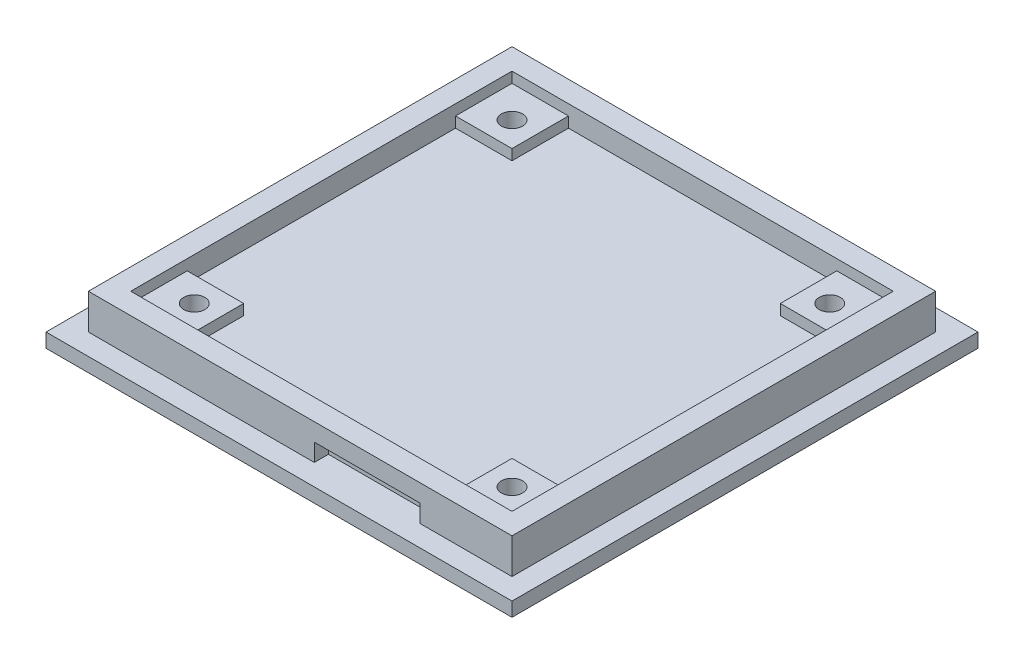
ISO-10303-21;
HEADER;
FILE_DESCRIPTION(('STEP AP214'),'2;1');
FILE_NAME('part.step','',(''),(''),'','','');
FILE_SCHEMA(('AUTOMOTIVE_DESIGN { 1 0 10303 214 1 1 1 1 }'));
ENDSEC;
DATA;
#1=APPLICATION_CONTEXT('core data for automotive mechanical design processes');
#2=APPLICATION_PROTOCOL_DEFINITION('international standard','automotive_design',2000,#1);
#3=PRODUCT_CONTEXT('',#1,'mechanical');
#4=PRODUCT('Part','Part','',(#3));
#5=PRODUCT_RELATED_PRODUCT_CATEGORY('part','',(#4));
#6=PRODUCT_DEFINITION_FORMATION('','',#4);
#7=PRODUCT_DEFINITION_CONTEXT('part definition',#1,'design');
#8=PRODUCT_DEFINITION('design','',#6,#7);
#9=PRODUCT_DEFINITION_SHAPE('','',#8);
#10=(LENGTH_UNIT() NAMED_UNIT(*) SI_UNIT(.MILLI.,.METRE.));
#11=(NAMED_UNIT(*) PLANE_ANGLE_UNIT() SI_UNIT($,.RADIAN.));
#12=(NAMED_UNIT(*) SI_UNIT($,.STERADIAN.) SOLID_ANGLE_UNIT());
#13=UNCERTAINTY_MEASURE_WITH_UNIT(LENGTH_MEASURE(1.E-05),#10,'distance_accuracy_value','');
#14=(GEOMETRIC_REPRESENTATION_CONTEXT(3) GLOBAL_UNCERTAINTY_ASSIGNED_CONTEXT((#13)) GLOBAL_UNIT_ASSIGNED_CONTEXT((#10,
#11,#12)) REPRESENTATION_CONTEXT('',''));
#15=CARTESIAN_POINT('',(0.,0.,0.));
#16=DIRECTION('',(0.,0.,1.));
#17=DIRECTION('',(1.,0.,0.));
#18=AXIS2_PLACEMENT_3D('',#15,#16,#17);
#19=CARTESIAN_POINT('',(0.,2.,0.));
#20=DIRECTION('',(0.,1.,0.));
#21=DIRECTION('',(0.,0.,1.));
#22=AXIS2_PLACEMENT_3D('',#19,#20,#21);
#23=PLANE('',#22);
#24=DIRECTION('',(-1.,0.,0.));
#25=VECTOR('',#24,1.);
#26=CARTESIAN_POINT('',(-18.9999999999995,2.,19.));
#27=LINE('',#26,#25);
#28=CARTESIAN_POINT('',(-18.9999999999995,2.,19.));
#29=VERTEX_POINT('',#28);
#30=CARTESIAN_POINT('',(-26.9999999999995,2.,19.));
#31=VERTEX_POINT('',#30);
#32=EDGE_CURVE('E257',#29,#31,#27,.T.);
#33=ORIENTED_EDGE('',*,*,#32,.F.);
#34=DIRECTION('',(0.,0.,-1.));
#35=VECTOR('',#34,1.);
#36=CARTESIAN_POINT('',(-18.9999999999995,2.,27.));
#37=LINE('',#36,#35);
#38=CARTESIAN_POINT('',(-18.9999999999995,2.,27.));
#39=VERTEX_POINT('',#38);
#40=EDGE_CURVE('E261',#39,#29,#37,.T.);
#41=ORIENTED_EDGE('',*,*,#40,.F.);
#42=DIRECTION('',(1.,0.,0.));
#43=VECTOR('',#42,1.);
#44=CARTESIAN_POINT('',(-27.,2.,27.));
#45=LINE('',#44,#43);
#46=CARTESIAN_POINT('',(19.0000000000005,2.,27.));
#47=VERTEX_POINT('',#46);
#48=EDGE_CURVE('E421',#39,#47,#45,.T.);
#49=ORIENTED_EDGE('',*,*,#48,.T.);
#50=DIRECTION('',(0.,0.,1.));
#51=VECTOR('',#50,1.);
#52=CARTESIAN_POINT('',(19.0000000000005,2.,27.));
#53=LINE('',#52,#51);
#54=CARTESIAN_POINT('',(19.0000000000005,2.,19.));
#55=VERTEX_POINT('',#54);
#56=EDGE_CURVE('E265',#55,#47,#53,.T.);
#57=ORIENTED_EDGE('',*,*,#56,.F.);
#58=DIRECTION('',(-1.,0.,0.));
#59=VECTOR('',#58,1.);
#60=CARTESIAN_POINT('',(27.0000000000005,2.,19.));
#61=LINE('',#60,#59);
#62=CARTESIAN_POINT('',(27.0000000000005,2.,19.));
#63=VERTEX_POINT('',#62);
#64=EDGE_CURVE('E263',#63,#55,#61,.T.);
#65=ORIENTED_EDGE('',*,*,#64,.F.);
#66=DIRECTION('',(0.,0.,-1.));
#67=VECTOR('',#66,1.);
#68=CARTESIAN_POINT('',(27.,2.,-27.));
#69=LINE('',#68,#67);
#70=CARTESIAN_POINT('',(27.,2.,-19.));
#71=VERTEX_POINT('',#70);
#72=EDGE_CURVE('E424',#63,#71,#69,.T.);
#73=ORIENTED_EDGE('',*,*,#72,.T.);
#74=DIRECTION('',(1.,0.,0.));
#75=VECTOR('',#74,1.);
#76=CARTESIAN_POINT('',(27.,2.,-19.));
#77=LINE('',#76,#75);
#78=CARTESIAN_POINT('',(19.,2.,-19.));
#79=VERTEX_POINT('',#78);
#80=EDGE_CURVE('E291',#79,#71,#77,.T.);
#81=ORIENTED_EDGE('',*,*,#80,.F.);
#82=DIRECTION('',(0.,0.,1.));
#83=VECTOR('',#82,1.);
#84=CARTESIAN_POINT('',(19.,2.,-19.));
#85=LINE('',#84,#83);
#86=CARTESIAN_POINT('',(19.,2.,-27.));
#87=VERTEX_POINT('',#86);
#88=EDGE_CURVE('E287',#87,#79,#85,.T.);
#89=ORIENTED_EDGE('',*,*,#88,.F.);
#90=DIRECTION('',(-1.,0.,0.));
#91=VECTOR('',#90,1.);
#92=CARTESIAN_POINT('',(-27.,2.,-27.));
#93=LINE('',#92,#91);
#94=CARTESIAN_POINT('',(-19.,2.,-27.));
#95=VERTEX_POINT('',#94);
#96=EDGE_CURVE('E426',#87,#95,#93,.T.);
#97=ORIENTED_EDGE('',*,*,#96,.T.);
#98=DIRECTION('',(0.,0.,-1.));
#99=VECTOR('',#98,1.);
#100=CARTESIAN_POINT('',(-19.,2.,-19.));
#101=LINE('',#100,#99);
#102=CARTESIAN_POINT('',(-19.,2.,-19.));
#103=VERTEX_POINT('',#102);
#104=EDGE_CURVE('E309',#103,#95,#101,.T.);
#105=ORIENTED_EDGE('',*,*,#104,.F.);
#106=DIRECTION('',(1.,0.,0.));
#107=VECTOR('',#106,1.);
#108=CARTESIAN_POINT('',(-19.,2.,-19.));
#109=LINE('',#108,#107);
#110=CARTESIAN_POINT('',(-27.,2.,-19.));
#111=VERTEX_POINT('',#110);
#112=EDGE_CURVE('E313',#111,#103,#109,.T.);
#113=ORIENTED_EDGE('',*,*,#112,.F.);
#114=DIRECTION('',(0.,0.,1.));
#115=VECTOR('',#114,1.);
#116=CARTESIAN_POINT('',(-27.,2.,-27.));
#117=LINE('',#116,#115);
#118=EDGE_CURVE('E418',#111,#31,#117,.T.);
#119=ORIENTED_EDGE('',*,*,#118,.T.);
#120=EDGE_LOOP('',(#33,#41,#49,#57,#65,#73,#81,#89,#97,#105,#113,#119));
#121=FACE_BOUND('',#120,.T.);
#122=ADVANCED_FACE('F32',(#121),#23,.T.);
#123=CARTESIAN_POINT('',(-27.,2.,27.));
#124=DIRECTION('',(0.,0.,1.));
#125=DIRECTION('',(1.,0.,0.));
#126=AXIS2_PLACEMENT_3D('',#123,#124,#125);
#127=PLANE('',#126);
#128=DIRECTION('',(0.,-1.,0.));
#129=VECTOR('',#128,1.);
#130=CARTESIAN_POINT('',(-18.9999999999995,3.5,27.));
#131=LINE('',#130,#129);
#132=CARTESIAN_POINT('',(-18.9999999999995,3.5,27.));
#133=VERTEX_POINT('',#132);
#134=EDGE_CURVE('E267',#133,#39,#131,.T.);
#135=ORIENTED_EDGE('',*,*,#134,.F.);
#136=DIRECTION('',(1.,0.,0.));
#137=VECTOR('',#136,1.);
#138=CARTESIAN_POINT('',(-18.9999999999995,3.5,27.));
#139=LINE('',#138,#137);
#140=CARTESIAN_POINT('',(-26.9999999999995,3.5,27.));
#141=VERTEX_POINT('',#140);
#142=EDGE_CURVE('E254',#141,#133,#139,.T.);
#143=ORIENTED_EDGE('',*,*,#142,.F.);
#144=DIRECTION('',(0.,1.,0.));
#145=VECTOR('',#144,1.);
#146=CARTESIAN_POINT('',(-27.,2.,27.));
#147=LINE('',#146,#145);
#148=CARTESIAN_POINT('',(-27.,5.,27.));
#149=VERTEX_POINT('',#148);
#150=EDGE_CURVE('E428',#141,#149,#147,.T.);
#151=ORIENTED_EDGE('',*,*,#150,.T.);
#152=DIRECTION('',(1.,0.,0.));
#153=VECTOR('',#152,1.);
#154=CARTESIAN_POINT('',(-27.,5.,27.));
#155=LINE('',#154,#153);
#156=CARTESIAN_POINT('',(27.,5.,27.));
#157=VERTEX_POINT('',#156);
#158=EDGE_CURVE('E431',#149,#157,#155,.T.);
#159=ORIENTED_EDGE('',*,*,#158,.T.);
#160=DIRECTION('',(0.,1.,0.));
#161=VECTOR('',#160,1.);
#162=CARTESIAN_POINT('',(27.,2.,27.));
#163=LINE('',#162,#161);
#164=CARTESIAN_POINT('',(27.0000000000005,3.5,27.));
#165=VERTEX_POINT('',#164);
#166=EDGE_CURVE('E444',#165,#157,#163,.T.);
#167=ORIENTED_EDGE('',*,*,#166,.F.);
#168=DIRECTION('',(1.,0.,0.));
#169=VECTOR('',#168,1.);
#170=CARTESIAN_POINT('',(27.0000000000005,3.5,27.));
#171=LINE('',#170,#169);
#172=CARTESIAN_POINT('',(19.0000000000005,3.5,27.));
#173=VERTEX_POINT('',#172);
#174=EDGE_CURVE('E278',#173,#165,#171,.T.);
#175=ORIENTED_EDGE('',*,*,#174,.F.);
#176=DIRECTION('',(0.,-1.,0.));
#177=VECTOR('',#176,1.);
#178=CARTESIAN_POINT('',(19.0000000000005,3.5,27.));
#179=LINE('',#178,#177);
#180=EDGE_CURVE('E55',#173,#47,#179,.T.);
#181=ORIENTED_EDGE('',*,*,#180,.T.);
#182=ORIENTED_EDGE('',*,*,#48,.F.);
#183=EDGE_LOOP('',(#135,#143,#151,#159,#167,#175,#181,#182));
#184=FACE_BOUND('',#183,.T.);
#185=ADVANCED_FACE('F538',(#184),#127,.F.);
#186=CARTESIAN_POINT('',(-27.,2.,-27.));
#187=DIRECTION('',(-1.,0.,0.));
#188=DIRECTION('',(0.,0.,1.));
#189=AXIS2_PLACEMENT_3D('',#186,#187,#188);
#190=PLANE('',#189);
#191=DIRECTION('',(0.,-1.,0.));
#192=VECTOR('',#191,1.);
#193=CARTESIAN_POINT('',(-26.9999999999995,3.5,19.));
#194=LINE('',#193,#192);
#195=CARTESIAN_POINT('',(-27.,3.5,19.));
#196=VERTEX_POINT('',#195);
#197=EDGE_CURVE('E47',#196,#31,#194,.T.);
#198=ORIENTED_EDGE('',*,*,#197,.T.);
#199=ORIENTED_EDGE('',*,*,#118,.F.);
#200=DIRECTION('',(0.,-1.,0.));
#201=VECTOR('',#200,1.);
#202=CARTESIAN_POINT('',(-27.,3.5,-19.));
#203=LINE('',#202,#201);
#204=CARTESIAN_POINT('',(-27.,3.5,-19.));
#205=VERTEX_POINT('',#204);
#206=EDGE_CURVE('E325',#205,#111,#203,.T.);
#207=ORIENTED_EDGE('',*,*,#206,.F.);
#208=DIRECTION('',(0.,0.,1.));
#209=VECTOR('',#208,1.);
#210=CARTESIAN_POINT('',(-27.,3.5,-19.));
#211=LINE('',#210,#209);
#212=CARTESIAN_POINT('',(-27.,3.5,-27.));
#213=VERTEX_POINT('',#212);
#214=EDGE_CURVE('E315',#213,#205,#211,.T.);
#215=ORIENTED_EDGE('',*,*,#214,.F.);
#216=DIRECTION('',(0.,1.,0.));
#217=VECTOR('',#216,1.);
#218=CARTESIAN_POINT('',(-27.,2.,-27.));
#219=LINE('',#218,#217);
#220=CARTESIAN_POINT('',(-27.,5.,-27.));
#221=VERTEX_POINT('',#220);
#222=EDGE_CURVE('E439',#213,#221,#219,.T.);
#223=ORIENTED_EDGE('',*,*,#222,.T.);
#224=DIRECTION('',(0.,0.,1.));
#225=VECTOR('',#224,1.);
#226=CARTESIAN_POINT('',(-27.,5.,-27.));
#227=LINE('',#226,#225);
#228=EDGE_CURVE('E417',#221,#149,#227,.T.);
#229=ORIENTED_EDGE('',*,*,#228,.T.);
#230=ORIENTED_EDGE('',*,*,#150,.F.);
#231=DIRECTION('',(0.,0.,1.));
#232=VECTOR('',#231,1.);
#233=CARTESIAN_POINT('',(-26.9999999999995,3.5,27.));
#234=LINE('',#233,#232);
#235=EDGE_CURVE('E248',#196,#141,#234,.T.);
#236=ORIENTED_EDGE('',*,*,#235,.F.);
#237=EDGE_LOOP('',(#198,#199,#207,#215,#223,#229,#230,#236));
#238=FACE_BOUND('',#237,.T.);
#239=ADVANCED_FACE('F544',(#238),#190,.F.);
#240=CARTESIAN_POINT('',(27.,2.,-27.));
#241=DIRECTION('',(1.,0.,0.));
#242=DIRECTION('',(0.,0.,-1.));
#243=AXIS2_PLACEMENT_3D('',#240,#241,#242);
#244=PLANE('',#243);
#245=DIRECTION('',(0.,-1.,0.));
#246=VECTOR('',#245,1.);
#247=CARTESIAN_POINT('',(27.0000000000005,3.5,19.));
#248=LINE('',#247,#246);
#249=CARTESIAN_POINT('',(27.0000000000005,3.5,19.));
#250=VERTEX_POINT('',#249);
#251=EDGE_CURVE('E285',#250,#63,#248,.T.);
#252=ORIENTED_EDGE('',*,*,#251,.F.);
#253=DIRECTION('',(0.,0.,-1.));
#254=VECTOR('',#253,1.);
#255=CARTESIAN_POINT('',(27.0000000000005,3.5,27.));
#256=LINE('',#255,#254);
#257=EDGE_CURVE('E271',#165,#250,#256,.T.);
#258=ORIENTED_EDGE('',*,*,#257,.F.);
#259=ORIENTED_EDGE('',*,*,#166,.T.);
#260=DIRECTION('',(0.,0.,-1.));
#261=VECTOR('',#260,1.);
#262=CARTESIAN_POINT('',(27.,5.,-27.));
#263=LINE('',#262,#261);
#264=CARTESIAN_POINT('',(27.,5.,-27.));
#265=VERTEX_POINT('',#264);
#266=EDGE_CURVE('E434',#157,#265,#263,.T.);
#267=ORIENTED_EDGE('',*,*,#266,.T.);
#268=DIRECTION('',(0.,1.,0.));
#269=VECTOR('',#268,1.);
#270=CARTESIAN_POINT('',(27.,2.,-27.));
#271=LINE('',#270,#269);
#272=CARTESIAN_POINT('',(27.,3.5,-27.));
#273=VERTEX_POINT('',#272);
#274=EDGE_CURVE('E442',#273,#265,#271,.T.);
#275=ORIENTED_EDGE('',*,*,#274,.F.);
#276=DIRECTION('',(0.,0.,-1.));
#277=VECTOR('',#276,1.);
#278=CARTESIAN_POINT('',(27.,3.5,-19.));
#279=LINE('',#278,#277);
#280=CARTESIAN_POINT('',(27.,3.5,-19.));
#281=VERTEX_POINT('',#280);
#282=EDGE_CURVE('E288',#281,#273,#279,.T.);
#283=ORIENTED_EDGE('',*,*,#282,.F.);
#284=DIRECTION('',(0.,-1.,0.));
#285=VECTOR('',#284,1.);
#286=CARTESIAN_POINT('',(27.,3.5,-19.));
#287=LINE('',#286,#285);
#288=EDGE_CURVE('E298',#281,#71,#287,.T.);
#289=ORIENTED_EDGE('',*,*,#288,.T.);
#290=ORIENTED_EDGE('',*,*,#72,.F.);
#291=EDGE_LOOP('',(#252,#258,#259,#267,#275,#283,#289,#290));
#292=FACE_BOUND('',#291,.T.);
#293=ADVANCED_FACE('F552',(#292),#244,.F.);
#294=CARTESIAN_POINT('',(-27.,2.,-27.));
#295=DIRECTION('',(0.,0.,-1.));
#296=DIRECTION('',(-1.,0.,0.));
#297=AXIS2_PLACEMENT_3D('',#294,#295,#296);
#298=PLANE('',#297);
#299=DIRECTION('',(0.,-1.,0.));
#300=VECTOR('',#299,1.);
#301=CARTESIAN_POINT('',(19.,3.5,-27.));
#302=LINE('',#301,#300);
#303=CARTESIAN_POINT('',(19.,3.5,-27.));
#304=VERTEX_POINT('',#303);
#305=EDGE_CURVE('E307',#304,#87,#302,.T.);
#306=ORIENTED_EDGE('',*,*,#305,.F.);
#307=DIRECTION('',(-1.,0.,0.));
#308=VECTOR('',#307,1.);
#309=CARTESIAN_POINT('',(27.,3.5,-27.));
#310=LINE('',#309,#308);
#311=EDGE_CURVE('E290',#273,#304,#310,.T.);
#312=ORIENTED_EDGE('',*,*,#311,.F.);
#313=ORIENTED_EDGE('',*,*,#274,.T.);
#314=DIRECTION('',(-1.,0.,0.));
#315=VECTOR('',#314,1.);
#316=CARTESIAN_POINT('',(-27.,5.,-27.));
#317=LINE('',#316,#315);
#318=EDGE_CURVE('E422',#265,#221,#317,.T.);
#319=ORIENTED_EDGE('',*,*,#318,.T.);
#320=ORIENTED_EDGE('',*,*,#222,.F.);
#321=DIRECTION('',(-1.,0.,0.));
#322=VECTOR('',#321,1.);
#323=CARTESIAN_POINT('',(-19.,3.5,-27.));
#324=LINE('',#323,#322);
#325=CARTESIAN_POINT('',(-19.,3.5,-27.));
#326=VERTEX_POINT('',#325);
#327=EDGE_CURVE('E312',#326,#213,#324,.T.);
#328=ORIENTED_EDGE('',*,*,#327,.F.);
#329=DIRECTION('',(0.,-1.,0.));
#330=VECTOR('',#329,1.);
#331=CARTESIAN_POINT('',(-19.,3.5,-27.));
#332=LINE('',#331,#330);
#333=EDGE_CURVE('E327',#326,#95,#332,.T.);
#334=ORIENTED_EDGE('',*,*,#333,.T.);
#335=ORIENTED_EDGE('',*,*,#96,.F.);
#336=EDGE_LOOP('',(#306,#312,#313,#319,#320,#328,#334,#335));
#337=FACE_BOUND('',#336,.T.);
#338=ADVANCED_FACE('F549',(#337),#298,.F.);
#339=CARTESIAN_POINT('',(-30.,5.,30.));
#340=DIRECTION('',(0.,0.,-1.));
#341=DIRECTION('',(-1.,0.,0.));
#342=AXIS2_PLACEMENT_3D('',#339,#340,#341);
#343=PLANE('',#342);
#344=DIRECTION('',(0.,-1.,0.));
#345=VECTOR('',#344,1.);
#346=CARTESIAN_POINT('',(17.,2.5,30.));
#347=LINE('',#346,#345);
#348=CARTESIAN_POINT('',(17.,2.5,30.));
#349=VERTEX_POINT('',#348);
#350=CARTESIAN_POINT('',(17.,0.,30.));
#351=VERTEX_POINT('',#350);
#352=EDGE_CURVE('E384',#349,#351,#347,.T.);
#353=ORIENTED_EDGE('',*,*,#352,.T.);
#354=DIRECTION('',(1.,0.,0.));
#355=VECTOR('',#354,1.);
#356=CARTESIAN_POINT('',(-30.,0.,30.));
#357=LINE('',#356,#355);
#358=CARTESIAN_POINT('',(30.,0.,30.));
#359=VERTEX_POINT('',#358);
#360=EDGE_CURVE('E460',#351,#359,#357,.T.);
#361=ORIENTED_EDGE('',*,*,#360,.T.);
#362=DIRECTION('',(0.,-1.,0.));
#363=VECTOR('',#362,1.);
#364=CARTESIAN_POINT('',(30.,5.,30.));
#365=LINE('',#364,#363);
#366=CARTESIAN_POINT('',(30.,5.,30.));
#367=VERTEX_POINT('',#366);
#368=EDGE_CURVE('E40',#367,#359,#365,.T.);
#369=ORIENTED_EDGE('',*,*,#368,.F.);
#370=DIRECTION('',(1.,0.,0.));
#371=VECTOR('',#370,1.);
#372=CARTESIAN_POINT('',(-30.,5.,30.));
#373=LINE('',#372,#371);
#374=CARTESIAN_POINT('',(-30.,5.,30.));
#375=VERTEX_POINT('',#374);
#376=EDGE_CURVE('E450',#375,#367,#373,.T.);
#377=ORIENTED_EDGE('',*,*,#376,.F.);
#378=DIRECTION('',(0.,-1.,0.));
#379=VECTOR('',#378,1.);
#380=CARTESIAN_POINT('',(-30.,5.,30.));
#381=LINE('',#380,#379);
#382=CARTESIAN_POINT('',(-30.,0.,30.));
#383=VERTEX_POINT('',#382);
#384=EDGE_CURVE('E11',#375,#383,#381,.T.);
#385=ORIENTED_EDGE('',*,*,#384,.T.);
#386=CARTESIAN_POINT('',(2.,0.,30.));
#387=VERTEX_POINT('',#386);
#388=EDGE_CURVE('E461',#383,#387,#357,.T.);
#389=ORIENTED_EDGE('',*,*,#388,.T.);
#390=DIRECTION('',(0.,1.,0.));
#391=VECTOR('',#390,1.);
#392=CARTESIAN_POINT('',(2.,2.5,30.));
#393=LINE('',#392,#391);
#394=CARTESIAN_POINT('',(2.,2.5,30.));
#395=VERTEX_POINT('',#394);
#396=EDGE_CURVE('E404',#387,#395,#393,.T.);
#397=ORIENTED_EDGE('',*,*,#396,.T.);
#398=DIRECTION('',(1.,0.,0.));
#399=VECTOR('',#398,1.);
#400=CARTESIAN_POINT('',(17.,2.5,30.));
#401=LINE('',#400,#399);
#402=EDGE_CURVE('E395',#395,#349,#401,.T.);
#403=ORIENTED_EDGE('',*,*,#402,.T.);
#404=EDGE_LOOP('',(#353,#361,#369,#377,#385,#389,#397,#403));
#405=FACE_BOUND('',#404,.T.);
#406=ADVANCED_FACE('F482',(#405),#343,.F.);
#407=CARTESIAN_POINT('',(-30.,5.,-30.));
#408=DIRECTION('',(1.,0.,0.));
#409=DIRECTION('',(0.,0.,-1.));
#410=AXIS2_PLACEMENT_3D('',#407,#408,#409);
#411=PLANE('',#410);
#412=DIRECTION('',(0.,0.,1.));
#413=VECTOR('',#412,1.);
#414=CARTESIAN_POINT('',(-30.,0.,-30.));
#415=LINE('',#414,#413);
#416=CARTESIAN_POINT('',(-30.,0.,-30.));
#417=VERTEX_POINT('',#416);
#418=EDGE_CURVE('E441',#417,#383,#415,.T.);
#419=ORIENTED_EDGE('',*,*,#418,.T.);
#420=ORIENTED_EDGE('',*,*,#384,.F.);
#421=DIRECTION('',(0.,0.,1.));
#422=VECTOR('',#421,1.);
#423=CARTESIAN_POINT('',(-30.,5.,-30.));
#424=LINE('',#423,#422);
#425=CARTESIAN_POINT('',(-30.,5.,-30.));
#426=VERTEX_POINT('',#425);
#427=EDGE_CURVE('E447',#426,#375,#424,.T.);
#428=ORIENTED_EDGE('',*,*,#427,.F.);
#429=DIRECTION('',(0.,-1.,0.));
#430=VECTOR('',#429,1.);
#431=CARTESIAN_POINT('',(-30.,5.,-30.));
#432=LINE('',#431,#430);
#433=EDGE_CURVE('E457',#426,#417,#432,.T.);
#434=ORIENTED_EDGE('',*,*,#433,.T.);
#435=EDGE_LOOP('',(#419,#420,#428,#434));
#436=FACE_BOUND('',#435,.T.);
#437=ADVANCED_FACE('F34',(#436),#411,.F.);
#438=CARTESIAN_POINT('',(30.,5.,-30.));
#439=DIRECTION('',(-1.,0.,0.));
#440=DIRECTION('',(0.,0.,1.));
#441=AXIS2_PLACEMENT_3D('',#438,#439,#440);
#442=PLANE('',#441);
#443=DIRECTION('',(0.,0.,-1.));
#444=VECTOR('',#443,1.);
#445=CARTESIAN_POINT('',(30.,0.,-30.));
#446=LINE('',#445,#444);
#447=CARTESIAN_POINT('',(30.,0.,-30.));
#448=VERTEX_POINT('',#447);
#449=EDGE_CURVE('E464',#359,#448,#446,.T.);
#450=ORIENTED_EDGE('',*,*,#449,.T.);
#451=DIRECTION('',(0.,-1.,0.));
#452=VECTOR('',#451,1.);
#453=CARTESIAN_POINT('',(30.,5.,-30.));
#454=LINE('',#453,#452);
#455=CARTESIAN_POINT('',(30.,5.,-30.));
#456=VERTEX_POINT('',#455);
#457=EDGE_CURVE('E472',#456,#448,#454,.T.);
#458=ORIENTED_EDGE('',*,*,#457,.F.);
#459=DIRECTION('',(0.,0.,-1.));
#460=VECTOR('',#459,1.);
#461=CARTESIAN_POINT('',(30.,5.,-30.));
#462=LINE('',#461,#460);
#463=EDGE_CURVE('E453',#367,#456,#462,.T.);
#464=ORIENTED_EDGE('',*,*,#463,.F.);
#465=ORIENTED_EDGE('',*,*,#368,.T.);
#466=EDGE_LOOP('',(#450,#458,#464,#465));
#467=FACE_BOUND('',#466,.T.);
#468=ADVANCED_FACE('F478',(#467),#442,.F.);
#469=CARTESIAN_POINT('',(-30.,5.,-30.));
#470=DIRECTION('',(0.,0.,1.));
#471=DIRECTION('',(1.,0.,0.));
#472=AXIS2_PLACEMENT_3D('',#469,#470,#471);
#473=PLANE('',#472);
#474=DIRECTION('',(-1.,0.,0.));
#475=VECTOR('',#474,1.);
#476=CARTESIAN_POINT('',(-30.,0.,-30.));
#477=LINE('',#476,#475);
#478=CARTESIAN_POINT('',(23.5,0.,-30.));
#479=VERTEX_POINT('',#478);
#480=EDGE_CURVE('E451',#448,#479,#477,.T.);
#481=ORIENTED_EDGE('',*,*,#480,.T.);
#482=DIRECTION('',(0.,-1.,0.));
#483=VECTOR('',#482,1.);
#484=CARTESIAN_POINT('',(23.5,0.,-30.));
#485=LINE('',#484,#483);
#486=CARTESIAN_POINT('',(23.5,2.,-30.));
#487=VERTEX_POINT('',#486);
#488=EDGE_CURVE('E360',#487,#479,#485,.T.);
#489=ORIENTED_EDGE('',*,*,#488,.F.);
#490=DIRECTION('',(1.,0.,0.));
#491=VECTOR('',#490,1.);
#492=CARTESIAN_POINT('',(23.5,2.,-30.));
#493=LINE('',#492,#491);
#494=CARTESIAN_POINT('',(11.5,2.,-30.));
#495=VERTEX_POINT('',#494);
#496=EDGE_CURVE('E365',#495,#487,#493,.T.);
#497=ORIENTED_EDGE('',*,*,#496,.F.);
#498=DIRECTION('',(0.,1.,0.));
#499=VECTOR('',#498,1.);
#500=CARTESIAN_POINT('',(11.5,0.,-30.));
#501=LINE('',#500,#499);
#502=CARTESIAN_POINT('',(11.5,0.,-30.));
#503=VERTEX_POINT('',#502);
#504=EDGE_CURVE('E377',#503,#495,#501,.T.);
#505=ORIENTED_EDGE('',*,*,#504,.F.);
#506=EDGE_CURVE('E467',#503,#417,#477,.T.);
#507=ORIENTED_EDGE('',*,*,#506,.T.);
#508=ORIENTED_EDGE('',*,*,#433,.F.);
#509=DIRECTION('',(-1.,0.,0.));
#510=VECTOR('',#509,1.);
#511=CARTESIAN_POINT('',(-30.,5.,-30.));
#512=LINE('',#511,#510);
#513=EDGE_CURVE('E455',#456,#426,#512,.T.);
#514=ORIENTED_EDGE('',*,*,#513,.F.);
#515=ORIENTED_EDGE('',*,*,#457,.T.);
#516=EDGE_LOOP('',(#481,#489,#497,#505,#507,#508,#514,#515));
#517=FACE_BOUND('',#516,.T.);
#518=ADVANCED_FACE('F508',(#517),#473,.F.);
#519=CARTESIAN_POINT('',(0.,5.,0.));
#520=DIRECTION('',(0.,1.,0.));
#521=DIRECTION('',(0.,0.,1.));
#522=AXIS2_PLACEMENT_3D('',#519,#520,#521);
#523=PLANE('',#522);
#524=ORIENTED_EDGE('',*,*,#228,.F.);
#525=ORIENTED_EDGE('',*,*,#318,.F.);
#526=ORIENTED_EDGE('',*,*,#266,.F.);
#527=ORIENTED_EDGE('',*,*,#158,.F.);
#528=EDGE_LOOP('',(#524,#525,#526,#527));
#529=FACE_BOUND('',#528,.T.);
#530=ORIENTED_EDGE('',*,*,#427,.T.);
#531=ORIENTED_EDGE('',*,*,#376,.T.);
#532=ORIENTED_EDGE('',*,*,#463,.T.);
#533=ORIENTED_EDGE('',*,*,#513,.T.);
#534=EDGE_LOOP('',(#530,#531,#532,#533));
#535=FACE_BOUND('',#534,.T.);
#536=ADVANCED_FACE('F525',(#529,#535),#523,.T.);
#537=CARTESIAN_POINT('',(17.,2.5,28.));
#538=DIRECTION('',(-1.,0.,0.));
#539=DIRECTION('',(0.,0.,1.));
#540=AXIS2_PLACEMENT_3D('',#537,#538,#539);
#541=PLANE('',#540);
#542=ORIENTED_EDGE('',*,*,#352,.F.);
#543=DIRECTION('',(0.,0.,1.));
#544=VECTOR('',#543,1.);
#545=CARTESIAN_POINT('',(17.,2.5,28.));
#546=LINE('',#545,#544);
#547=CARTESIAN_POINT('',(17.,2.5,28.));
#548=VERTEX_POINT('',#547);
#549=EDGE_CURVE('E401',#548,#349,#546,.T.);
#550=ORIENTED_EDGE('',*,*,#549,.F.);
#551=DIRECTION('',(0.,-1.,0.));
#552=VECTOR('',#551,1.);
#553=CARTESIAN_POINT('',(17.,2.5,28.));
#554=LINE('',#553,#552);
#555=CARTESIAN_POINT('',(17.,0.,28.));
#556=VERTEX_POINT('',#555);
#557=EDGE_CURVE('E391',#548,#556,#554,.T.);
#558=ORIENTED_EDGE('',*,*,#557,.T.);
#559=DIRECTION('',(0.,0.,1.));
#560=VECTOR('',#559,1.);
#561=CARTESIAN_POINT('',(17.,0.,28.));
#562=LINE('',#561,#560);
#563=EDGE_CURVE('E414',#556,#351,#562,.T.);
#564=ORIENTED_EDGE('',*,*,#563,.T.);
#565=EDGE_LOOP('',(#542,#550,#558,#564));
#566=FACE_BOUND('',#565,.T.);
#567=ADVANCED_FACE('F488',(#566),#541,.T.);
#568=CARTESIAN_POINT('',(2.,2.5,28.));
#569=DIRECTION('',(1.,0.,0.));
#570=DIRECTION('',(0.,0.,-1.));
#571=AXIS2_PLACEMENT_3D('',#568,#569,#570);
#572=PLANE('',#571);
#573=ORIENTED_EDGE('',*,*,#396,.F.);
#574=DIRECTION('',(0.,0.,1.));
#575=VECTOR('',#574,1.);
#576=CARTESIAN_POINT('',(2.,0.,28.));
#577=LINE('',#576,#575);
#578=CARTESIAN_POINT('',(2.,0.,28.));
#579=VERTEX_POINT('',#578);
#580=EDGE_CURVE('E412',#579,#387,#577,.T.);
#581=ORIENTED_EDGE('',*,*,#580,.F.);
#582=DIRECTION('',(0.,1.,0.));
#583=VECTOR('',#582,1.);
#584=CARTESIAN_POINT('',(2.,2.5,28.));
#585=LINE('',#584,#583);
#586=CARTESIAN_POINT('',(2.,2.5,28.));
#587=VERTEX_POINT('',#586);
#588=EDGE_CURVE('E397',#579,#587,#585,.T.);
#589=ORIENTED_EDGE('',*,*,#588,.T.);
#590=DIRECTION('',(0.,0.,1.));
#591=VECTOR('',#590,1.);
#592=CARTESIAN_POINT('',(2.,2.5,28.));
#593=LINE('',#592,#591);
#594=EDGE_CURVE('E410',#587,#395,#593,.T.);
#595=ORIENTED_EDGE('',*,*,#594,.T.);
#596=EDGE_LOOP('',(#573,#581,#589,#595));
#597=FACE_BOUND('',#596,.T.);
#598=ADVANCED_FACE('F498',(#597),#572,.T.);
#599=CARTESIAN_POINT('',(17.,2.5,28.));
#600=DIRECTION('',(0.,-1.,0.));
#601=DIRECTION('',(0.,0.,-1.));
#602=AXIS2_PLACEMENT_3D('',#599,#600,#601);
#603=PLANE('',#602);
#604=ORIENTED_EDGE('',*,*,#402,.F.);
#605=ORIENTED_EDGE('',*,*,#594,.F.);
#606=DIRECTION('',(1.,0.,0.));
#607=VECTOR('',#606,1.);
#608=CARTESIAN_POINT('',(17.,2.5,28.));
#609=LINE('',#608,#607);
#610=EDGE_CURVE('E399',#587,#548,#609,.T.);
#611=ORIENTED_EDGE('',*,*,#610,.T.);
#612=ORIENTED_EDGE('',*,*,#549,.T.);
#613=EDGE_LOOP('',(#604,#605,#611,#612));
#614=FACE_BOUND('',#613,.T.);
#615=ADVANCED_FACE('F699',(#614),#603,.T.);
#616=CARTESIAN_POINT('',(0.,0.,28.));
#617=DIRECTION('',(0.,0.,-1.));
#618=DIRECTION('',(-1.,0.,0.));
#619=AXIS2_PLACEMENT_3D('',#616,#617,#618);
#620=PLANE('',#619);
#621=ORIENTED_EDGE('',*,*,#557,.F.);
#622=ORIENTED_EDGE('',*,*,#610,.F.);
#623=ORIENTED_EDGE('',*,*,#588,.F.);
#624=DIRECTION('',(-1.,0.,0.));
#625=VECTOR('',#624,1.);
#626=CARTESIAN_POINT('',(17.,0.,28.));
#627=LINE('',#626,#625);
#628=EDGE_CURVE('E394',#556,#579,#627,.T.);
#629=ORIENTED_EDGE('',*,*,#628,.F.);
#630=EDGE_LOOP('',(#621,#622,#623,#629));
#631=FACE_BOUND('',#630,.T.);
#632=ADVANCED_FACE('F493',(#631),#620,.F.);
#633=CARTESIAN_POINT('',(23.5,0.,-28.));
#634=DIRECTION('',(1.,0.,0.));
#635=DIRECTION('',(0.,0.,-1.));
#636=AXIS2_PLACEMENT_3D('',#633,#634,#635);
#637=PLANE('',#636);
#638=ORIENTED_EDGE('',*,*,#488,.T.);
#639=DIRECTION('',(0.,0.,-1.));
#640=VECTOR('',#639,1.);
#641=CARTESIAN_POINT('',(23.5,0.,-28.));
#642=LINE('',#641,#640);
#643=CARTESIAN_POINT('',(23.5,0.,-28.));
#644=VERTEX_POINT('',#643);
#645=EDGE_CURVE('E374',#644,#479,#642,.T.);
#646=ORIENTED_EDGE('',*,*,#645,.F.);
#647=DIRECTION('',(0.,-1.,0.));
#648=VECTOR('',#647,1.);
#649=CARTESIAN_POINT('',(23.5,0.,-28.));
#650=LINE('',#649,#648);
#651=CARTESIAN_POINT('',(23.5,2.,-28.));
#652=VERTEX_POINT('',#651);
#653=EDGE_CURVE('E361',#652,#644,#650,.T.);
#654=ORIENTED_EDGE('',*,*,#653,.F.);
#655=DIRECTION('',(0.,0.,-1.));
#656=VECTOR('',#655,1.);
#657=CARTESIAN_POINT('',(23.5,2.,-28.));
#658=LINE('',#657,#656);
#659=EDGE_CURVE('E382',#652,#487,#658,.T.);
#660=ORIENTED_EDGE('',*,*,#659,.T.);
#661=EDGE_LOOP('',(#638,#646,#654,#660));
#662=FACE_BOUND('',#661,.T.);
#663=ADVANCED_FACE('F519',(#662),#637,.F.);
#664=CARTESIAN_POINT('',(23.5,2.,-28.));
#665=DIRECTION('',(0.,1.,0.));
#666=DIRECTION('',(0.,0.,1.));
#667=AXIS2_PLACEMENT_3D('',#664,#665,#666);
#668=PLANE('',#667);
#669=ORIENTED_EDGE('',*,*,#496,.T.);
#670=ORIENTED_EDGE('',*,*,#659,.F.);
#671=DIRECTION('',(1.,0.,0.));
#672=VECTOR('',#671,1.);
#673=CARTESIAN_POINT('',(23.5,2.,-28.));
#674=LINE('',#673,#672);
#675=CARTESIAN_POINT('',(11.5,2.,-28.));
#676=VERTEX_POINT('',#675);
#677=EDGE_CURVE('E371',#676,#652,#674,.T.);
#678=ORIENTED_EDGE('',*,*,#677,.F.);
#679=DIRECTION('',(0.,0.,-1.));
#680=VECTOR('',#679,1.);
#681=CARTESIAN_POINT('',(11.5,2.,-28.));
#682=LINE('',#681,#680);
#683=EDGE_CURVE('E385',#676,#495,#682,.T.);
#684=ORIENTED_EDGE('',*,*,#683,.T.);
#685=EDGE_LOOP('',(#669,#670,#678,#684));
#686=FACE_BOUND('',#685,.T.);
#687=ADVANCED_FACE('F523',(#686),#668,.F.);
#688=CARTESIAN_POINT('',(11.5,0.,-28.));
#689=DIRECTION('',(-1.,0.,0.));
#690=DIRECTION('',(0.,0.,1.));
#691=AXIS2_PLACEMENT_3D('',#688,#689,#690);
#692=PLANE('',#691);
#693=ORIENTED_EDGE('',*,*,#504,.T.);
#694=ORIENTED_EDGE('',*,*,#683,.F.);
#695=DIRECTION('',(0.,1.,0.));
#696=VECTOR('',#695,1.);
#697=CARTESIAN_POINT('',(11.5,0.,-28.));
#698=LINE('',#697,#696);
#699=CARTESIAN_POINT('',(11.5,0.,-28.));
#700=VERTEX_POINT('',#699);
#701=EDGE_CURVE('E368',#700,#676,#698,.T.);
#702=ORIENTED_EDGE('',*,*,#701,.F.);
#703=DIRECTION('',(0.,0.,-1.));
#704=VECTOR('',#703,1.);
#705=CARTESIAN_POINT('',(11.5,0.,-28.));
#706=LINE('',#705,#704);
#707=EDGE_CURVE('E387',#700,#503,#706,.T.);
#708=ORIENTED_EDGE('',*,*,#707,.T.);
#709=EDGE_LOOP('',(#693,#694,#702,#708));
#710=FACE_BOUND('',#709,.T.);
#711=ADVANCED_FACE('F513',(#710),#692,.F.);
#712=CARTESIAN_POINT('',(0.,0.,-28.));
#713=DIRECTION('',(0.,0.,1.));
#714=DIRECTION('',(1.,0.,0.));
#715=AXIS2_PLACEMENT_3D('',#712,#713,#714);
#716=PLANE('',#715);
#717=ORIENTED_EDGE('',*,*,#653,.T.);
#718=DIRECTION('',(-1.,0.,0.));
#719=VECTOR('',#718,1.);
#720=CARTESIAN_POINT('',(23.5,0.,-28.));
#721=LINE('',#720,#719);
#722=EDGE_CURVE('E364',#644,#700,#721,.T.);
#723=ORIENTED_EDGE('',*,*,#722,.T.);
#724=ORIENTED_EDGE('',*,*,#701,.T.);
#725=ORIENTED_EDGE('',*,*,#677,.T.);
#726=EDGE_LOOP('',(#717,#723,#724,#725));
#727=FACE_BOUND('',#726,.T.);
#728=ADVANCED_FACE('F520',(#727),#716,.F.);
#729=CARTESIAN_POINT('',(0.,0.,0.));
#730=DIRECTION('',(0.,-1.,0.));
#731=DIRECTION('',(0.,0.,-1.));
#732=AXIS2_PLACEMENT_3D('',#729,#730,#731);
#733=PLANE('',#732);
#734=DIRECTION('',(0.,0.,-1.));
#735=VECTOR('',#734,1.);
#736=CARTESIAN_POINT('',(-33.,0.,33.));
#737=LINE('',#736,#735);
#738=CARTESIAN_POINT('',(-33.,0.,33.));
#739=VERTEX_POINT('',#738);
#740=CARTESIAN_POINT('',(-33.,0.,-33.));
#741=VERTEX_POINT('',#740);
#742=EDGE_CURVE('E330',#739,#741,#737,.T.);
#743=ORIENTED_EDGE('',*,*,#742,.F.);
#744=DIRECTION('',(-1.,0.,0.));
#745=VECTOR('',#744,1.);
#746=CARTESIAN_POINT('',(-33.,0.,33.));
#747=LINE('',#746,#745);
#748=CARTESIAN_POINT('',(33.,0.,33.));
#749=VERTEX_POINT('',#748);
#750=EDGE_CURVE('E335',#749,#739,#747,.T.);
#751=ORIENTED_EDGE('',*,*,#750,.F.);
#752=DIRECTION('',(0.,0.,1.));
#753=VECTOR('',#752,1.);
#754=CARTESIAN_POINT('',(33.,0.,33.));
#755=LINE('',#754,#753);
#756=CARTESIAN_POINT('',(33.,0.,-33.));
#757=VERTEX_POINT('',#756);
#758=EDGE_CURVE('E346',#757,#749,#755,.T.);
#759=ORIENTED_EDGE('',*,*,#758,.F.);
#760=DIRECTION('',(1.,0.,0.));
#761=VECTOR('',#760,1.);
#762=CARTESIAN_POINT('',(-33.,0.,-33.));
#763=LINE('',#762,#761);
#764=EDGE_CURVE('E344',#741,#757,#763,.T.);
#765=ORIENTED_EDGE('',*,*,#764,.F.);
#766=EDGE_LOOP('',(#743,#751,#759,#765));
#767=FACE_BOUND('',#766,.T.);
#768=ORIENTED_EDGE('',*,*,#563,.F.);
#769=ORIENTED_EDGE('',*,*,#628,.T.);
#770=ORIENTED_EDGE('',*,*,#580,.T.);
#771=ORIENTED_EDGE('',*,*,#388,.F.);
#772=ORIENTED_EDGE('',*,*,#418,.F.);
#773=ORIENTED_EDGE('',*,*,#506,.F.);
#774=ORIENTED_EDGE('',*,*,#707,.F.);
#775=ORIENTED_EDGE('',*,*,#722,.F.);
#776=ORIENTED_EDGE('',*,*,#645,.T.);
#777=ORIENTED_EDGE('',*,*,#480,.F.);
#778=ORIENTED_EDGE('',*,*,#449,.F.);
#779=ORIENTED_EDGE('',*,*,#360,.F.);
#780=EDGE_LOOP('',(#768,#769,#770,#771,#772,#773,#774,#775,#776,#777,#778,#779));
#781=FACE_BOUND('',#780,.T.);
#782=ADVANCED_FACE('F485',(#767,#781),#733,.F.);
#783=CARTESIAN_POINT('',(-33.,-2.,33.));
#784=DIRECTION('',(1.,0.,0.));
#785=DIRECTION('',(0.,0.,-1.));
#786=AXIS2_PLACEMENT_3D('',#783,#784,#785);
#787=PLANE('',#786);
#788=ORIENTED_EDGE('',*,*,#742,.T.);
#789=DIRECTION('',(0.,1.,0.));
#790=VECTOR('',#789,1.);
#791=CARTESIAN_POINT('',(-33.,-2.,-33.));
#792=LINE('',#791,#790);
#793=CARTESIAN_POINT('',(-33.,-2.,-33.));
#794=VERTEX_POINT('',#793);
#795=EDGE_CURVE('E357',#794,#741,#792,.T.);
#796=ORIENTED_EDGE('',*,*,#795,.F.);
#797=DIRECTION('',(0.,0.,-1.));
#798=VECTOR('',#797,1.);
#799=CARTESIAN_POINT('',(-33.,-2.,33.));
#800=LINE('',#799,#798);
#801=CARTESIAN_POINT('',(-33.,-2.,33.));
#802=VERTEX_POINT('',#801);
#803=EDGE_CURVE('E331',#802,#794,#800,.T.);
#804=ORIENTED_EDGE('',*,*,#803,.F.);
#805=DIRECTION('',(0.,1.,0.));
#806=VECTOR('',#805,1.);
#807=CARTESIAN_POINT('',(-33.,-2.,33.));
#808=LINE('',#807,#806);
#809=EDGE_CURVE('E341',#802,#739,#808,.T.);
#810=ORIENTED_EDGE('',*,*,#809,.T.);
#811=EDGE_LOOP('',(#788,#796,#804,#810));
#812=FACE_BOUND('',#811,.T.);
#813=ADVANCED_FACE('F673',(#812),#787,.F.);
#814=CARTESIAN_POINT('',(-33.,-2.,-33.));
#815=DIRECTION('',(0.,0.,1.));
#816=DIRECTION('',(1.,0.,0.));
#817=AXIS2_PLACEMENT_3D('',#814,#815,#816);
#818=PLANE('',#817);
#819=ORIENTED_EDGE('',*,*,#764,.T.);
#820=DIRECTION('',(0.,1.,0.));
#821=VECTOR('',#820,1.);
#822=CARTESIAN_POINT('',(33.,-2.,-33.));
#823=LINE('',#822,#821);
#824=CARTESIAN_POINT('',(33.,-2.,-33.));
#825=VERTEX_POINT('',#824);
#826=EDGE_CURVE('E354',#825,#757,#823,.T.);
#827=ORIENTED_EDGE('',*,*,#826,.F.);
#828=DIRECTION('',(1.,0.,0.));
#829=VECTOR('',#828,1.);
#830=CARTESIAN_POINT('',(-33.,-2.,-33.));
#831=LINE('',#830,#829);
#832=EDGE_CURVE('E334',#794,#825,#831,.T.);
#833=ORIENTED_EDGE('',*,*,#832,.F.);
#834=ORIENTED_EDGE('',*,*,#795,.T.);
#835=EDGE_LOOP('',(#819,#827,#833,#834));
#836=FACE_BOUND('',#835,.T.);
#837=ADVANCED_FACE('F681',(#836),#818,.F.);
#838=CARTESIAN_POINT('',(33.,-2.,33.));
#839=DIRECTION('',(-1.,0.,0.));
#840=DIRECTION('',(0.,0.,1.));
#841=AXIS2_PLACEMENT_3D('',#838,#839,#840);
#842=PLANE('',#841);
#843=ORIENTED_EDGE('',*,*,#758,.T.);
#844=DIRECTION('',(0.,1.,0.));
#845=VECTOR('',#844,1.);
#846=CARTESIAN_POINT('',(33.,-2.,33.));
#847=LINE('',#846,#845);
#848=CARTESIAN_POINT('',(33.,-2.,33.));
#849=VERTEX_POINT('',#848);
#850=EDGE_CURVE('E351',#849,#749,#847,.T.);
#851=ORIENTED_EDGE('',*,*,#850,.F.);
#852=DIRECTION('',(0.,0.,1.));
#853=VECTOR('',#852,1.);
#854=CARTESIAN_POINT('',(33.,-2.,33.));
#855=LINE('',#854,#853);
#856=EDGE_CURVE('E337',#825,#849,#855,.T.);
#857=ORIENTED_EDGE('',*,*,#856,.F.);
#858=ORIENTED_EDGE('',*,*,#826,.T.);
#859=EDGE_LOOP('',(#843,#851,#857,#858));
#860=FACE_BOUND('',#859,.T.);
#861=ADVANCED_FACE('F677',(#860),#842,.F.);
#862=CARTESIAN_POINT('',(-33.,-2.,33.));
#863=DIRECTION('',(0.,0.,-1.));
#864=DIRECTION('',(-1.,0.,0.));
#865=AXIS2_PLACEMENT_3D('',#862,#863,#864);
#866=PLANE('',#865);
#867=ORIENTED_EDGE('',*,*,#750,.T.);
#868=ORIENTED_EDGE('',*,*,#809,.F.);
#869=DIRECTION('',(-1.,0.,0.));
#870=VECTOR('',#869,1.);
#871=CARTESIAN_POINT('',(-33.,-2.,33.));
#872=LINE('',#871,#870);
#873=EDGE_CURVE('E339',#849,#802,#872,.T.);
#874=ORIENTED_EDGE('',*,*,#873,.F.);
#875=ORIENTED_EDGE('',*,*,#850,.T.);
#876=EDGE_LOOP('',(#867,#868,#874,#875));
#877=FACE_BOUND('',#876,.T.);
#878=ADVANCED_FACE('F669',(#877),#866,.F.);
#879=CARTESIAN_POINT('',(0.,-2.,0.));
#880=DIRECTION('',(0.,-1.,0.));
#881=DIRECTION('',(0.,0.,-1.));
#882=AXIS2_PLACEMENT_3D('',#879,#880,#881);
#883=PLANE('',#882);
#884=CARTESIAN_POINT('',(-22.4999999999995,-2.,22.5));
#885=DIRECTION('',(0.,-1.,0.));
#886=DIRECTION('',(0.,0.,-1.));
#887=AXIS2_PLACEMENT_3D('',#884,#885,#886);
#888=CIRCLE('',#887,1.5);
#889=CARTESIAN_POINT('',(-22.4999999999995,-2.,21.));
#890=VERTEX_POINT('',#889);
#891=EDGE_CURVE('E611',#890,#890,#888,.F.);
#892=ORIENTED_EDGE('',*,*,#891,.T.);
#893=EDGE_LOOP('',(#892));
#894=FACE_BOUND('',#893,.T.);
#895=CARTESIAN_POINT('',(22.5000000000005,-2.,22.5));
#896=DIRECTION('',(0.,-1.,0.));
#897=DIRECTION('',(0.,0.,-1.));
#898=AXIS2_PLACEMENT_3D('',#895,#896,#897);
#899=CIRCLE('',#898,1.5);
#900=CARTESIAN_POINT('',(22.5000000000005,-2.,21.));
#901=VERTEX_POINT('',#900);
#902=EDGE_CURVE('E605',#901,#901,#899,.F.);
#903=ORIENTED_EDGE('',*,*,#902,.T.);
#904=EDGE_LOOP('',(#903));
#905=FACE_BOUND('',#904,.T.);
#906=CARTESIAN_POINT('',(22.5,-2.,-22.5));
#907=DIRECTION('',(0.,-1.,0.));
#908=DIRECTION('',(0.,0.,-1.));
#909=AXIS2_PLACEMENT_3D('',#906,#907,#908);
#910=CIRCLE('',#909,1.5);
#911=CARTESIAN_POINT('',(22.5,-2.,-24.));
#912=VERTEX_POINT('',#911);
#913=EDGE_CURVE('E597',#912,#912,#910,.F.);
#914=ORIENTED_EDGE('',*,*,#913,.T.);
#915=EDGE_LOOP('',(#914));
#916=FACE_BOUND('',#915,.T.);
#917=CARTESIAN_POINT('',(-22.5,-2.,-22.5));
#918=DIRECTION('',(0.,-1.,0.));
#919=DIRECTION('',(0.,0.,-1.));
#920=AXIS2_PLACEMENT_3D('',#917,#918,#919);
#921=CIRCLE('',#920,1.5);
#922=CARTESIAN_POINT('',(-22.5,-2.,-24.));
#923=VERTEX_POINT('',#922);
#924=EDGE_CURVE('E590',#923,#923,#921,.F.);
#925=ORIENTED_EDGE('',*,*,#924,.T.);
#926=EDGE_LOOP('',(#925));
#927=FACE_BOUND('',#926,.T.);
#928=ORIENTED_EDGE('',*,*,#803,.T.);
#929=ORIENTED_EDGE('',*,*,#832,.T.);
#930=ORIENTED_EDGE('',*,*,#856,.T.);
#931=ORIENTED_EDGE('',*,*,#873,.T.);
#932=EDGE_LOOP('',(#928,#929,#930,#931));
#933=FACE_BOUND('',#932,.T.);
#934=ADVANCED_FACE('F666',(#894,#905,#916,#927,#933),#883,.T.);
#935=CARTESIAN_POINT('',(-19.,3.5,-19.));
#936=DIRECTION('',(-1.,0.,0.));
#937=DIRECTION('',(0.,0.,1.));
#938=AXIS2_PLACEMENT_3D('',#935,#936,#937);
#939=PLANE('',#938);
#940=ORIENTED_EDGE('',*,*,#104,.T.);
#941=ORIENTED_EDGE('',*,*,#333,.F.);
#942=DIRECTION('',(0.,0.,-1.));
#943=VECTOR('',#942,1.);
#944=CARTESIAN_POINT('',(-19.,3.5,-19.));
#945=LINE('',#944,#943);
#946=CARTESIAN_POINT('',(-19.,3.5,-19.));
#947=VERTEX_POINT('',#946);
#948=EDGE_CURVE('E310',#947,#326,#945,.T.);
#949=ORIENTED_EDGE('',*,*,#948,.F.);
#950=DIRECTION('',(0.,-1.,0.));
#951=VECTOR('',#950,1.);
#952=CARTESIAN_POINT('',(-19.,3.5,-19.));
#953=LINE('',#952,#951);
#954=EDGE_CURVE('E319',#947,#103,#953,.T.);
#955=ORIENTED_EDGE('',*,*,#954,.T.);
#956=EDGE_LOOP('',(#940,#941,#949,#955));
#957=FACE_BOUND('',#956,.T.);
#958=ADVANCED_FACE('F571',(#957),#939,.F.);
#959=CARTESIAN_POINT('',(-19.,3.5,-19.));
#960=DIRECTION('',(0.,0.,-1.));
#961=DIRECTION('',(-1.,0.,0.));
#962=AXIS2_PLACEMENT_3D('',#959,#960,#961);
#963=PLANE('',#962);
#964=ORIENTED_EDGE('',*,*,#112,.T.);
#965=ORIENTED_EDGE('',*,*,#954,.F.);
#966=DIRECTION('',(1.,0.,0.));
#967=VECTOR('',#966,1.);
#968=CARTESIAN_POINT('',(-19.,3.5,-19.));
#969=LINE('',#968,#967);
#970=EDGE_CURVE('E317',#205,#947,#969,.T.);
#971=ORIENTED_EDGE('',*,*,#970,.F.);
#972=ORIENTED_EDGE('',*,*,#206,.T.);
#973=EDGE_LOOP('',(#964,#965,#971,#972));
#974=FACE_BOUND('',#973,.T.);
#975=ADVANCED_FACE('F567',(#974),#963,.F.);
#976=CARTESIAN_POINT('',(0.,3.5,0.));
#977=DIRECTION('',(0.,1.,0.));
#978=DIRECTION('',(0.,0.,1.));
#979=AXIS2_PLACEMENT_3D('',#976,#977,#978);
#980=PLANE('',#979);
#981=CARTESIAN_POINT('',(-22.5,3.5,-22.5));
#982=DIRECTION('',(0.,1.,0.));
#983=DIRECTION('',(0.,0.,1.));
#984=AXIS2_PLACEMENT_3D('',#981,#982,#983);
#985=CIRCLE('',#984,1.5);
#986=CARTESIAN_POINT('',(-22.5,3.5,-21.));
#987=VERTEX_POINT('',#986);
#988=EDGE_CURVE('E592',#987,#987,#985,.T.);
#989=ORIENTED_EDGE('',*,*,#988,.F.);
#990=EDGE_LOOP('',(#989));
#991=FACE_BOUND('',#990,.T.);
#992=ORIENTED_EDGE('',*,*,#948,.T.);
#993=ORIENTED_EDGE('',*,*,#327,.T.);
#994=ORIENTED_EDGE('',*,*,#214,.T.);
#995=ORIENTED_EDGE('',*,*,#970,.T.);
#996=EDGE_LOOP('',(#992,#993,#994,#995));
#997=FACE_BOUND('',#996,.T.);
#998=ADVANCED_FACE('F575',(#991,#997),#980,.T.);
#999=CARTESIAN_POINT('',(19.,3.5,-19.));
#1000=DIRECTION('',(1.,0.,0.));
#1001=DIRECTION('',(0.,0.,-1.));
#1002=AXIS2_PLACEMENT_3D('',#999,#1000,#1001);
#1003=PLANE('',#1002);
#1004=ORIENTED_EDGE('',*,*,#88,.T.);
#1005=DIRECTION('',(0.,-1.,0.));
#1006=VECTOR('',#1005,1.);
#1007=CARTESIAN_POINT('',(19.,3.5,-19.));
#1008=LINE('',#1007,#1006);
#1009=CARTESIAN_POINT('',(19.,3.5,-19.));
#1010=VERTEX_POINT('',#1009);
#1011=EDGE_CURVE('E304',#1010,#79,#1008,.T.);
#1012=ORIENTED_EDGE('',*,*,#1011,.F.);
#1013=DIRECTION('',(0.,0.,1.));
#1014=VECTOR('',#1013,1.);
#1015=CARTESIAN_POINT('',(19.,3.5,-19.));
#1016=LINE('',#1015,#1014);
#1017=EDGE_CURVE('E293',#304,#1010,#1016,.T.);
#1018=ORIENTED_EDGE('',*,*,#1017,.F.);
#1019=ORIENTED_EDGE('',*,*,#305,.T.);
#1020=EDGE_LOOP('',(#1004,#1012,#1018,#1019));
#1021=FACE_BOUND('',#1020,.T.);
#1022=ADVANCED_FACE('F654',(#1021),#1003,.F.);
#1023=CARTESIAN_POINT('',(27.,3.5,-19.));
#1024=DIRECTION('',(0.,0.,-1.));
#1025=DIRECTION('',(-1.,0.,0.));
#1026=AXIS2_PLACEMENT_3D('',#1023,#1024,#1025);
#1027=PLANE('',#1026);
#1028=ORIENTED_EDGE('',*,*,#80,.T.);
#1029=ORIENTED_EDGE('',*,*,#288,.F.);
#1030=DIRECTION('',(1.,0.,0.));
#1031=VECTOR('',#1030,1.);
#1032=CARTESIAN_POINT('',(27.,3.5,-19.));
#1033=LINE('',#1032,#1031);
#1034=EDGE_CURVE('E295',#1010,#281,#1033,.T.);
#1035=ORIENTED_EDGE('',*,*,#1034,.F.);
#1036=ORIENTED_EDGE('',*,*,#1011,.T.);
#1037=EDGE_LOOP('',(#1028,#1029,#1035,#1036));
#1038=FACE_BOUND('',#1037,.T.);
#1039=ADVANCED_FACE('F650',(#1038),#1027,.F.);
#1040=CARTESIAN_POINT('',(0.,3.5,0.));
#1041=DIRECTION('',(0.,1.,0.));
#1042=DIRECTION('',(0.,0.,1.));
#1043=AXIS2_PLACEMENT_3D('',#1040,#1041,#1042);
#1044=PLANE('',#1043);
#1045=CARTESIAN_POINT('',(22.5,3.5,-22.5));
#1046=DIRECTION('',(0.,1.,0.));
#1047=DIRECTION('',(0.,0.,1.));
#1048=AXIS2_PLACEMENT_3D('',#1045,#1046,#1047);
#1049=CIRCLE('',#1048,1.5);
#1050=CARTESIAN_POINT('',(22.5,3.5,-21.));
#1051=VERTEX_POINT('',#1050);
#1052=EDGE_CURVE('E602',#1051,#1051,#1049,.T.);
#1053=ORIENTED_EDGE('',*,*,#1052,.F.);
#1054=EDGE_LOOP('',(#1053));
#1055=FACE_BOUND('',#1054,.T.);
#1056=ORIENTED_EDGE('',*,*,#282,.T.);
#1057=ORIENTED_EDGE('',*,*,#311,.T.);
#1058=ORIENTED_EDGE('',*,*,#1017,.T.);
#1059=ORIENTED_EDGE('',*,*,#1034,.T.);
#1060=EDGE_LOOP('',(#1056,#1057,#1058,#1059));
#1061=FACE_BOUND('',#1060,.T.);
#1062=ADVANCED_FACE('F646',(#1055,#1061),#1044,.T.);
#1063=CARTESIAN_POINT('',(27.0000000000005,3.5,19.));
#1064=DIRECTION('',(0.,0.,1.));
#1065=DIRECTION('',(1.,0.,0.));
#1066=AXIS2_PLACEMENT_3D('',#1063,#1064,#1065);
#1067=PLANE('',#1066);
#1068=ORIENTED_EDGE('',*,*,#64,.T.);
#1069=DIRECTION('',(0.,-1.,0.));
#1070=VECTOR('',#1069,1.);
#1071=CARTESIAN_POINT('',(19.0000000000005,3.5,19.));
#1072=LINE('',#1071,#1070);
#1073=CARTESIAN_POINT('',(19.0000000000005,3.5,19.));
#1074=VERTEX_POINT('',#1073);
#1075=EDGE_CURVE('E282',#1074,#55,#1072,.T.);
#1076=ORIENTED_EDGE('',*,*,#1075,.F.);
#1077=DIRECTION('',(-1.,0.,0.));
#1078=VECTOR('',#1077,1.);
#1079=CARTESIAN_POINT('',(27.0000000000005,3.5,19.));
#1080=LINE('',#1079,#1078);
#1081=EDGE_CURVE('E274',#250,#1074,#1080,.T.);
#1082=ORIENTED_EDGE('',*,*,#1081,.F.);
#1083=ORIENTED_EDGE('',*,*,#251,.T.);
#1084=EDGE_LOOP('',(#1068,#1076,#1082,#1083));
#1085=FACE_BOUND('',#1084,.T.);
#1086=ADVANCED_FACE('F643',(#1085),#1067,.F.);
#1087=CARTESIAN_POINT('',(19.0000000000005,3.5,27.));
#1088=DIRECTION('',(1.,0.,0.));
#1089=DIRECTION('',(0.,0.,-1.));
#1090=AXIS2_PLACEMENT_3D('',#1087,#1088,#1089);
#1091=PLANE('',#1090);
#1092=ORIENTED_EDGE('',*,*,#56,.T.);
#1093=ORIENTED_EDGE('',*,*,#180,.F.);
#1094=DIRECTION('',(0.,0.,1.));
#1095=VECTOR('',#1094,1.);
#1096=CARTESIAN_POINT('',(19.0000000000005,3.5,27.));
#1097=LINE('',#1096,#1095);
#1098=EDGE_CURVE('E276',#1074,#173,#1097,.T.);
#1099=ORIENTED_EDGE('',*,*,#1098,.F.);
#1100=ORIENTED_EDGE('',*,*,#1075,.T.);
#1101=EDGE_LOOP('',(#1092,#1093,#1099,#1100));
#1102=FACE_BOUND('',#1101,.T.);
#1103=ADVANCED_FACE('F639',(#1102),#1091,.F.);
#1104=CARTESIAN_POINT('',(0.,3.5,0.));
#1105=DIRECTION('',(0.,1.,0.));
#1106=DIRECTION('',(0.,0.,1.));
#1107=AXIS2_PLACEMENT_3D('',#1104,#1105,#1106);
#1108=PLANE('',#1107);
#1109=CARTESIAN_POINT('',(22.5000000000005,3.5,22.5));
#1110=DIRECTION('',(0.,1.,0.));
#1111=DIRECTION('',(0.,0.,1.));
#1112=AXIS2_PLACEMENT_3D('',#1109,#1110,#1111);
#1113=CIRCLE('',#1112,1.5);
#1114=CARTESIAN_POINT('',(22.5000000000005,3.5,24.));
#1115=VERTEX_POINT('',#1114);
#1116=EDGE_CURVE('E608',#1115,#1115,#1113,.T.);
#1117=ORIENTED_EDGE('',*,*,#1116,.F.);
#1118=EDGE_LOOP('',(#1117));
#1119=FACE_BOUND('',#1118,.T.);
#1120=ORIENTED_EDGE('',*,*,#257,.T.);
#1121=ORIENTED_EDGE('',*,*,#1081,.T.);
#1122=ORIENTED_EDGE('',*,*,#1098,.T.);
#1123=ORIENTED_EDGE('',*,*,#174,.T.);
#1124=EDGE_LOOP('',(#1120,#1121,#1122,#1123));
#1125=FACE_BOUND('',#1124,.T.);
#1126=ADVANCED_FACE('F636',(#1119,#1125),#1108,.T.);
#1127=CARTESIAN_POINT('',(-18.9999999999995,3.5,27.));
#1128=DIRECTION('',(-1.,0.,0.));
#1129=DIRECTION('',(0.,0.,1.));
#1130=AXIS2_PLACEMENT_3D('',#1127,#1128,#1129);
#1131=PLANE('',#1130);
#1132=ORIENTED_EDGE('',*,*,#40,.T.);
#1133=DIRECTION('',(0.,-1.,0.));
#1134=VECTOR('',#1133,1.);
#1135=CARTESIAN_POINT('',(-18.9999999999995,3.5,19.));
#1136=LINE('',#1135,#1134);
#1137=CARTESIAN_POINT('',(-18.9999999999995,3.5,19.));
#1138=VERTEX_POINT('',#1137);
#1139=EDGE_CURVE('E244',#1138,#29,#1136,.T.);
#1140=ORIENTED_EDGE('',*,*,#1139,.F.);
#1141=DIRECTION('',(0.,0.,-1.));
#1142=VECTOR('',#1141,1.);
#1143=CARTESIAN_POINT('',(-18.9999999999995,3.5,27.));
#1144=LINE('',#1143,#1142);
#1145=EDGE_CURVE('E249',#133,#1138,#1144,.T.);
#1146=ORIENTED_EDGE('',*,*,#1145,.F.);
#1147=ORIENTED_EDGE('',*,*,#134,.T.);
#1148=EDGE_LOOP('',(#1132,#1140,#1146,#1147));
#1149=FACE_BOUND('',#1148,.T.);
#1150=ADVANCED_FACE('F259',(#1149),#1131,.F.);
#1151=CARTESIAN_POINT('',(-18.9999999999995,3.5,19.));
#1152=DIRECTION('',(0.,0.,1.));
#1153=DIRECTION('',(1.,0.,0.));
#1154=AXIS2_PLACEMENT_3D('',#1151,#1152,#1153);
#1155=PLANE('',#1154);
#1156=ORIENTED_EDGE('',*,*,#32,.T.);
#1157=ORIENTED_EDGE('',*,*,#197,.F.);
#1158=DIRECTION('',(-1.,0.,0.));
#1159=VECTOR('',#1158,1.);
#1160=CARTESIAN_POINT('',(-18.9999999999995,3.5,19.));
#1161=LINE('',#1160,#1159);
#1162=EDGE_CURVE('E240',#1138,#196,#1161,.T.);
#1163=ORIENTED_EDGE('',*,*,#1162,.F.);
#1164=ORIENTED_EDGE('',*,*,#1139,.T.);
#1165=EDGE_LOOP('',(#1156,#1157,#1163,#1164));
#1166=FACE_BOUND('',#1165,.T.);
#1167=ADVANCED_FACE('F242',(#1166),#1155,.F.);
#1168=CARTESIAN_POINT('',(0.,3.5,0.));
#1169=DIRECTION('',(0.,1.,0.));
#1170=DIRECTION('',(0.,0.,1.));
#1171=AXIS2_PLACEMENT_3D('',#1168,#1169,#1170);
#1172=PLANE('',#1171);
#1173=CARTESIAN_POINT('',(-22.4999999999995,3.5,22.5));
#1174=DIRECTION('',(0.,1.,0.));
#1175=DIRECTION('',(0.,0.,1.));
#1176=AXIS2_PLACEMENT_3D('',#1173,#1174,#1175);
#1177=CIRCLE('',#1176,1.5);
#1178=CARTESIAN_POINT('',(-22.4999999999995,3.5,24.));
#1179=VERTEX_POINT('',#1178);
#1180=EDGE_CURVE('E614',#1179,#1179,#1177,.T.);
#1181=ORIENTED_EDGE('',*,*,#1180,.F.);
#1182=EDGE_LOOP('',(#1181));
#1183=FACE_BOUND('',#1182,.T.);
#1184=ORIENTED_EDGE('',*,*,#1145,.T.);
#1185=ORIENTED_EDGE('',*,*,#1162,.T.);
#1186=ORIENTED_EDGE('',*,*,#235,.T.);
#1187=ORIENTED_EDGE('',*,*,#142,.T.);
#1188=EDGE_LOOP('',(#1184,#1185,#1186,#1187));
#1189=FACE_BOUND('',#1188,.T.);
#1190=ADVANCED_FACE('F252',(#1183,#1189),#1172,.T.);
#1191=CARTESIAN_POINT('',(-22.5,-6.24264068711929,-22.5));
#1192=DIRECTION('',(0.,1.,0.));
#1193=DIRECTION('',(0.,0.,1.));
#1194=AXIS2_PLACEMENT_3D('',#1191,#1192,#1193);
#1195=CYLINDRICAL_SURFACE('',#1194,1.5);
#1196=ORIENTED_EDGE('',*,*,#988,.T.);
#1197=EDGE_LOOP('',(#1196));
#1198=FACE_BOUND('',#1197,.T.);
#1199=ORIENTED_EDGE('',*,*,#924,.F.);
#1200=EDGE_LOOP('',(#1199));
#1201=FACE_BOUND('',#1200,.T.);
#1202=ADVANCED_FACE('F622',(#1198,#1201),#1195,.F.);
#1203=CARTESIAN_POINT('',(22.5,-6.24264068711929,-22.5));
#1204=DIRECTION('',(0.,1.,0.));
#1205=DIRECTION('',(0.,0.,1.));
#1206=AXIS2_PLACEMENT_3D('',#1203,#1204,#1205);
#1207=CYLINDRICAL_SURFACE('',#1206,1.5);
#1208=ORIENTED_EDGE('',*,*,#1052,.T.);
#1209=EDGE_LOOP('',(#1208));
#1210=FACE_BOUND('',#1209,.T.);
#1211=ORIENTED_EDGE('',*,*,#913,.F.);
#1212=EDGE_LOOP('',(#1211));
#1213=FACE_BOUND('',#1212,.T.);
#1214=ADVANCED_FACE('F628',(#1210,#1213),#1207,.F.);
#1215=CARTESIAN_POINT('',(22.5000000000005,-6.24264068711929,22.5));
#1216=DIRECTION('',(0.,1.,0.));
#1217=DIRECTION('',(0.,0.,1.));
#1218=AXIS2_PLACEMENT_3D('',#1215,#1216,#1217);
#1219=CYLINDRICAL_SURFACE('',#1218,1.5);
#1220=ORIENTED_EDGE('',*,*,#1116,.T.);
#1221=EDGE_LOOP('',(#1220));
#1222=FACE_BOUND('',#1221,.T.);
#1223=ORIENTED_EDGE('',*,*,#902,.F.);
#1224=EDGE_LOOP('',(#1223));
#1225=FACE_BOUND('',#1224,.T.);
#1226=ADVANCED_FACE('F822',(#1222,#1225),#1219,.F.);
#1227=CARTESIAN_POINT('',(-22.4999999999995,-6.24264068711929,22.5));
#1228=DIRECTION('',(0.,1.,0.));
#1229=DIRECTION('',(0.,0.,1.));
#1230=AXIS2_PLACEMENT_3D('',#1227,#1228,#1229);
#1231=CYLINDRICAL_SURFACE('',#1230,1.5);
#1232=ORIENTED_EDGE('',*,*,#1180,.T.);
#1233=EDGE_LOOP('',(#1232));
#1234=FACE_BOUND('',#1233,.T.);
#1235=ORIENTED_EDGE('',*,*,#891,.F.);
#1236=EDGE_LOOP('',(#1235));
#1237=FACE_BOUND('',#1236,.T.);
#1238=ADVANCED_FACE('F618',(#1234,#1237),#1231,.F.);
#1239=CLOSED_SHELL('',(#122,#185,#239,#293,#338,#406,#437,#468,#518,#536,#567,#598,#615,#632,
#663,#687,#711,#728,#782,#813,#837,#861,#878,#934,#958,#975,#998,#1022,#1039,#1062,#1086,#1103,
#1126,#1150,#1167,#1190,#1202,#1214,#1226,#1238));
#1240=MANIFOLD_SOLID_BREP('B2',#1239);
#1241=ADVANCED_BREP_SHAPE_REPRESENTATION('',(#18,#1240),#14);
#1242=SHAPE_DEFINITION_REPRESENTATION(#9,#1241);
ENDSEC;
END-ISO-10303-21;
